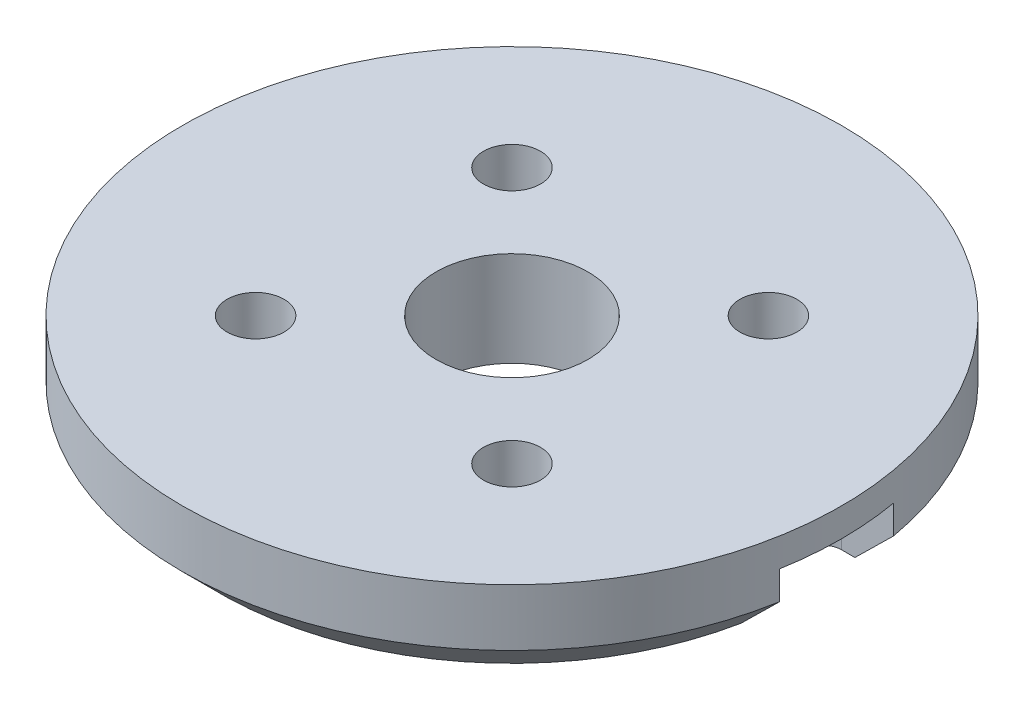
ISO-10303-21;
HEADER;
FILE_DESCRIPTION(('STEP AP214'),'2;1');
FILE_NAME('part.step','',(''),(''),'','','');
FILE_SCHEMA(('AUTOMOTIVE_DESIGN { 1 0 10303 214 1 1 1 1 }'));
ENDSEC;
DATA;
#1=APPLICATION_CONTEXT('core data for automotive mechanical design processes');
#2=APPLICATION_PROTOCOL_DEFINITION('international standard','automotive_design',2000,#1);
#3=PRODUCT_CONTEXT('',#1,'mechanical');
#4=PRODUCT('Part','Part','',(#3));
#5=PRODUCT_RELATED_PRODUCT_CATEGORY('part','',(#4));
#6=PRODUCT_DEFINITION_FORMATION('','',#4);
#7=PRODUCT_DEFINITION_CONTEXT('part definition',#1,'design');
#8=PRODUCT_DEFINITION('design','',#6,#7);
#9=PRODUCT_DEFINITION_SHAPE('','',#8);
#10=(LENGTH_UNIT() NAMED_UNIT(*) SI_UNIT(.MILLI.,.METRE.));
#11=(NAMED_UNIT(*) PLANE_ANGLE_UNIT() SI_UNIT($,.RADIAN.));
#12=(NAMED_UNIT(*) SI_UNIT($,.STERADIAN.) SOLID_ANGLE_UNIT());
#13=UNCERTAINTY_MEASURE_WITH_UNIT(LENGTH_MEASURE(1.E-05),#10,'distance_accuracy_value','');
#14=(GEOMETRIC_REPRESENTATION_CONTEXT(3) GLOBAL_UNCERTAINTY_ASSIGNED_CONTEXT((#13)) GLOBAL_UNIT_ASSIGNED_CONTEXT((#10,
#11,#12)) REPRESENTATION_CONTEXT('',''));
#15=CARTESIAN_POINT('',(0.,0.,0.));
#16=DIRECTION('',(0.,0.,1.));
#17=DIRECTION('',(1.,0.,0.));
#18=AXIS2_PLACEMENT_3D('',#15,#16,#17);
#19=CARTESIAN_POINT('',(0.,5.,0.));
#20=DIRECTION('',(0.,-1.,0.));
#21=DIRECTION('',(0.,0.,-1.));
#22=AXIS2_PLACEMENT_3D('',#19,#20,#21);
#23=CYLINDRICAL_SURFACE('',#22,17.35);
#24=CARTESIAN_POINT('',(0.,3.5,0.));
#25=DIRECTION('',(0.,-1.,0.));
#26=DIRECTION('',(0.,0.,-1.));
#27=AXIS2_PLACEMENT_3D('',#24,#25,#26);
#28=CIRCLE('',#27,17.35);
#29=CARTESIAN_POINT('',(17.0886658344061,3.5,-3.));
#30=VERTEX_POINT('',#29);
#31=CARTESIAN_POINT('',(17.0886658344061,3.5,3.));
#32=VERTEX_POINT('',#31);
#33=EDGE_CURVE('E11',#30,#32,#28,.T.);
#34=ORIENTED_EDGE('',*,*,#33,.F.);
#35=DIRECTION('',(0.,-1.,0.));
#36=VECTOR('',#35,1.);
#37=CARTESIAN_POINT('',(17.0886658344061,5.,-3.));
#38=LINE('',#37,#36);
#39=CARTESIAN_POINT('',(17.0886658344062,1.99999999999999,-3.));
#40=VERTEX_POINT('',#39);
#41=EDGE_CURVE('E144',#30,#40,#38,.T.);
#42=ORIENTED_EDGE('',*,*,#41,.T.);
#43=CARTESIAN_POINT('',(0.,1.99999999999999,0.));
#44=DIRECTION('',(0.,1.,0.));
#45=DIRECTION('',(0.,0.,1.));
#46=AXIS2_PLACEMENT_3D('',#43,#44,#45);
#47=CIRCLE('',#46,17.35);
#48=CARTESIAN_POINT('',(17.0886658344062,1.99999999999999,3.));
#49=VERTEX_POINT('',#48);
#50=EDGE_CURVE('E179',#40,#49,#47,.T.);
#51=ORIENTED_EDGE('',*,*,#50,.T.);
#52=DIRECTION('',(0.,-1.,0.));
#53=VECTOR('',#52,1.);
#54=CARTESIAN_POINT('',(17.0886658344061,5.,3.));
#55=LINE('',#54,#53);
#56=EDGE_CURVE('E55',#49,#32,#55,.F.);
#57=ORIENTED_EDGE('',*,*,#56,.T.);
#58=EDGE_LOOP('',(#34,#42,#51,#57));
#59=FACE_BOUND('',#58,.T.);
#60=CARTESIAN_POINT('',(0.,5.,0.));
#61=DIRECTION('',(0.,1.,0.));
#62=DIRECTION('',(0.,0.,1.));
#63=AXIS2_PLACEMENT_3D('',#60,#61,#62);
#64=CIRCLE('',#63,17.35);
#65=CARTESIAN_POINT('',(0.,5.,17.35));
#66=VERTEX_POINT('',#65);
#67=EDGE_CURVE('E174',#66,#66,#64,.T.);
#68=ORIENTED_EDGE('',*,*,#67,.F.);
#69=EDGE_LOOP('',(#68));
#70=FACE_BOUND('',#69,.T.);
#71=ADVANCED_FACE('F38',(#59,#70),#23,.T.);
#72=CARTESIAN_POINT('',(0.,5.,0.));
#73=DIRECTION('',(0.,1.,0.));
#74=DIRECTION('',(0.,0.,1.));
#75=AXIS2_PLACEMENT_3D('',#72,#73,#74);
#76=PLANE('',#75);
#77=CARTESIAN_POINT('',(6.75,5.,6.75000000000038));
#78=DIRECTION('',(0.,-1.,0.));
#79=DIRECTION('',(0.,0.,-1.));
#80=AXIS2_PLACEMENT_3D('',#77,#78,#79);
#81=CIRCLE('',#80,1.50000000000039);
#82=CARTESIAN_POINT('',(6.75,5.,5.24999999999999));
#83=VERTEX_POINT('',#82);
#84=EDGE_CURVE('E157',#83,#83,#81,.T.);
#85=ORIENTED_EDGE('',*,*,#84,.T.);
#86=EDGE_LOOP('',(#85));
#87=FACE_BOUND('',#86,.T.);
#88=CARTESIAN_POINT('',(-6.74999999999962,5.,-6.75));
#89=DIRECTION('',(0.,-1.,0.));
#90=DIRECTION('',(0.,0.,-1.));
#91=AXIS2_PLACEMENT_3D('',#88,#89,#90);
#92=CIRCLE('',#91,1.5000000000002);
#93=CARTESIAN_POINT('',(-6.74999999999962,5.,-8.2500000000002));
#94=VERTEX_POINT('',#93);
#95=EDGE_CURVE('E150',#94,#94,#92,.T.);
#96=ORIENTED_EDGE('',*,*,#95,.T.);
#97=EDGE_LOOP('',(#96));
#98=FACE_BOUND('',#97,.T.);
#99=CARTESIAN_POINT('',(6.75000000000038,5.,-6.74999999999962));
#100=DIRECTION('',(0.,-1.,0.));
#101=DIRECTION('',(0.,0.,-1.));
#102=AXIS2_PLACEMENT_3D('',#99,#100,#101);
#103=CIRCLE('',#102,1.50000000000053);
#104=CARTESIAN_POINT('',(6.75000000000038,5.,-8.25000000000015));
#105=VERTEX_POINT('',#104);
#106=EDGE_CURVE('E146',#105,#105,#103,.T.);
#107=ORIENTED_EDGE('',*,*,#106,.T.);
#108=EDGE_LOOP('',(#107));
#109=FACE_BOUND('',#108,.T.);
#110=CARTESIAN_POINT('',(-6.75,5.,6.75));
#111=DIRECTION('',(0.,-1.,0.));
#112=DIRECTION('',(0.,0.,-1.));
#113=AXIS2_PLACEMENT_3D('',#110,#111,#112);
#114=CIRCLE('',#113,1.5);
#115=CARTESIAN_POINT('',(-6.75,5.,5.25));
#116=VERTEX_POINT('',#115);
#117=EDGE_CURVE('E165',#116,#116,#114,.T.);
#118=ORIENTED_EDGE('',*,*,#117,.T.);
#119=EDGE_LOOP('',(#118));
#120=FACE_BOUND('',#119,.T.);
#121=CARTESIAN_POINT('',(0.,5.,0.));
#122=DIRECTION('',(0.,1.,0.));
#123=DIRECTION('',(0.,0.,1.));
#124=AXIS2_PLACEMENT_3D('',#121,#122,#123);
#125=CIRCLE('',#124,4.);
#126=CARTESIAN_POINT('',(0.,5.,4.));
#127=VERTEX_POINT('',#126);
#128=EDGE_CURVE('E168',#127,#127,#125,.T.);
#129=ORIENTED_EDGE('',*,*,#128,.F.);
#130=EDGE_LOOP('',(#129));
#131=FACE_BOUND('',#130,.T.);
#132=ORIENTED_EDGE('',*,*,#67,.T.);
#133=EDGE_LOOP('',(#132));
#134=FACE_BOUND('',#133,.T.);
#135=ADVANCED_FACE('F223',(#87,#98,#109,#120,#131,#134),#76,.T.);
#136=CARTESIAN_POINT('',(0.,0.,0.));
#137=DIRECTION('',(0.,1.,0.));
#138=DIRECTION('',(0.,0.,1.));
#139=AXIS2_PLACEMENT_3D('',#136,#137,#138);
#140=PLANE('',#139);
#141=CARTESIAN_POINT('',(6.75,0.,6.75000000000038));
#142=DIRECTION('',(0.,-1.,0.));
#143=DIRECTION('',(0.,0.,-1.));
#144=AXIS2_PLACEMENT_3D('',#141,#142,#143);
#145=CIRCLE('',#144,1.50000000000039);
#146=CARTESIAN_POINT('',(6.75,0.,5.24999999999999));
#147=VERTEX_POINT('',#146);
#148=EDGE_CURVE('E153',#147,#147,#145,.T.);
#149=ORIENTED_EDGE('',*,*,#148,.F.);
#150=EDGE_LOOP('',(#149));
#151=FACE_BOUND('',#150,.T.);
#152=CARTESIAN_POINT('',(-6.74999999999962,0.,-6.75));
#153=DIRECTION('',(0.,-1.,0.));
#154=DIRECTION('',(0.,0.,-1.));
#155=AXIS2_PLACEMENT_3D('',#152,#153,#154);
#156=CIRCLE('',#155,1.5000000000002);
#157=CARTESIAN_POINT('',(-6.74999999999962,0.,-8.2500000000002));
#158=VERTEX_POINT('',#157);
#159=EDGE_CURVE('E160',#158,#158,#156,.T.);
#160=ORIENTED_EDGE('',*,*,#159,.F.);
#161=EDGE_LOOP('',(#160));
#162=FACE_BOUND('',#161,.T.);
#163=CARTESIAN_POINT('',(6.75000000000038,0.,-6.74999999999962));
#164=DIRECTION('',(0.,-1.,0.));
#165=DIRECTION('',(0.,0.,-1.));
#166=AXIS2_PLACEMENT_3D('',#163,#164,#165);
#167=CIRCLE('',#166,1.50000000000053);
#168=CARTESIAN_POINT('',(6.75000000000038,0.,-8.25000000000015));
#169=VERTEX_POINT('',#168);
#170=EDGE_CURVE('E147',#169,#169,#167,.T.);
#171=ORIENTED_EDGE('',*,*,#170,.F.);
#172=EDGE_LOOP('',(#171));
#173=FACE_BOUND('',#172,.T.);
#174=CARTESIAN_POINT('',(-6.75,0.,6.75));
#175=DIRECTION('',(0.,-1.,0.));
#176=DIRECTION('',(0.,0.,-1.));
#177=AXIS2_PLACEMENT_3D('',#174,#175,#176);
#178=CIRCLE('',#177,1.5);
#179=CARTESIAN_POINT('',(-6.75,0.,5.25));
#180=VERTEX_POINT('',#179);
#181=EDGE_CURVE('E156',#180,#180,#178,.T.);
#182=ORIENTED_EDGE('',*,*,#181,.F.);
#183=EDGE_LOOP('',(#182));
#184=FACE_BOUND('',#183,.T.);
#185=CARTESIAN_POINT('',(0.,0.,0.));
#186=DIRECTION('',(0.,1.,0.));
#187=DIRECTION('',(0.,0.,1.));
#188=AXIS2_PLACEMENT_3D('',#185,#186,#187);
#189=CIRCLE('',#188,4.);
#190=CARTESIAN_POINT('',(0.,0.,4.));
#191=VERTEX_POINT('',#190);
#192=EDGE_CURVE('E171',#191,#191,#189,.T.);
#193=ORIENTED_EDGE('',*,*,#192,.T.);
#194=EDGE_LOOP('',(#193));
#195=FACE_BOUND('',#194,.T.);
#196=CARTESIAN_POINT('',(0.,0.,0.));
#197=DIRECTION('',(0.,1.,0.));
#198=DIRECTION('',(0.,0.,1.));
#199=AXIS2_PLACEMENT_3D('',#196,#197,#198);
#200=CIRCLE('',#199,15.35);
#201=CARTESIAN_POINT('',(15.0539861830679,0.,3.));
#202=VERTEX_POINT('',#201);
#203=CARTESIAN_POINT('',(15.0539861830679,0.,-3.));
#204=VERTEX_POINT('',#203);
#205=EDGE_CURVE('E182',#202,#204,#200,.F.);
#206=ORIENTED_EDGE('',*,*,#205,.T.);
#207=DIRECTION('',(1.,0.,0.));
#208=VECTOR('',#207,1.);
#209=CARTESIAN_POINT('',(14.35,0.,-3.));
#210=LINE('',#209,#208);
#211=CARTESIAN_POINT('',(14.35,0.,-3.));
#212=VERTEX_POINT('',#211);
#213=EDGE_CURVE('E105',#212,#204,#210,.T.);
#214=ORIENTED_EDGE('',*,*,#213,.F.);
#215=CARTESIAN_POINT('',(14.35,0.,-2.));
#216=DIRECTION('',(0.,-1.,0.));
#217=DIRECTION('',(0.,0.,-1.));
#218=AXIS2_PLACEMENT_3D('',#215,#216,#217);
#219=CIRCLE('',#218,1.);
#220=CARTESIAN_POINT('',(13.35,0.,-1.99999999999999));
#221=VERTEX_POINT('',#220);
#222=EDGE_CURVE('E134',#221,#212,#219,.T.);
#223=ORIENTED_EDGE('',*,*,#222,.F.);
#224=DIRECTION('',(0.,0.,-1.));
#225=VECTOR('',#224,1.);
#226=CARTESIAN_POINT('',(13.35,0.,1.99999999999999));
#227=LINE('',#226,#225);
#228=CARTESIAN_POINT('',(13.35,0.,1.99999999999999));
#229=VERTEX_POINT('',#228);
#230=EDGE_CURVE('E131',#229,#221,#227,.T.);
#231=ORIENTED_EDGE('',*,*,#230,.F.);
#232=CARTESIAN_POINT('',(14.35,0.,2.));
#233=DIRECTION('',(0.,-1.,0.));
#234=DIRECTION('',(0.,0.,-1.));
#235=AXIS2_PLACEMENT_3D('',#232,#233,#234);
#236=CIRCLE('',#235,1.);
#237=CARTESIAN_POINT('',(14.35,0.,3.));
#238=VERTEX_POINT('',#237);
#239=EDGE_CURVE('E129',#238,#229,#236,.T.);
#240=ORIENTED_EDGE('',*,*,#239,.F.);
#241=DIRECTION('',(-1.,0.,0.));
#242=VECTOR('',#241,1.);
#243=CARTESIAN_POINT('',(14.35,0.,3.));
#244=LINE('',#243,#242);
#245=EDGE_CURVE('E111',#202,#238,#244,.T.);
#246=ORIENTED_EDGE('',*,*,#245,.F.);
#247=EDGE_LOOP('',(#206,#214,#223,#231,#240,#246));
#248=FACE_BOUND('',#247,.T.);
#249=ADVANCED_FACE('F226',(#151,#162,#173,#184,#195,#248),#140,.F.);
#250=CARTESIAN_POINT('',(0.,1.99999999999999,0.));
#251=DIRECTION('',(0.,1.,0.));
#252=DIRECTION('',(0.,0.,1.));
#253=AXIS2_PLACEMENT_3D('',#250,#251,#252);
#254=CONICAL_SURFACE('',#253,17.35,0.785398163397452);
#255=CARTESIAN_POINT('',(11.3546192408097,-3.60575127546398,-3.));
#256=CARTESIAN_POINT('',(11.7485366715798,-3.22486695799007,-3.));
#257=CARTESIAN_POINT('',(12.1418435815279,-2.84335272127463,-3.));
#258=CARTESIAN_POINT('',(12.9274758383312,-2.07931661446152,-3.));
#259=CARTESIAN_POINT('',(13.3198011875421,-1.69679474678646,-3.));
#260=CARTESIAN_POINT('',(14.1037088254747,-0.930996550780616,-3.));
#261=CARTESIAN_POINT('',(14.4952911196089,-0.547720227987082,-3.));
#262=CARTESIAN_POINT('',(15.2778671345998,0.219433258865943,-3.));
#263=CARTESIAN_POINT('',(15.6688608550495,0.603310423340503,-3.));
#264=CARTESIAN_POINT('',(16.8411380556166,1.75564831448771,-3.));
#265=CARTESIAN_POINT('',(17.6217224403827,2.52482019839818,-3.));
#266=CARTESIAN_POINT('',(18.7916672889781,3.67952716645954,-3.));
#267=CARTESIAN_POINT('',(19.1814951006494,4.06458914850199,-3.));
#268=CARTESIAN_POINT('',(19.9608854980985,4.8349810377664,-3.));
#269=CARTESIAN_POINT('',(20.3504480840157,5.22031094484749,-3.));
#270=CARTESIAN_POINT('',(20.7399014346527,5.60575127546396,-3.));
#271=B_SPLINE_CURVE_WITH_KNOTS('',3,(#255,#256,#257,#258,#259,#260,#261,#262,#263,#264,#265,
#266,#267,#268,#269,#270),.UNSPECIFIED.,.F.,.F.,(4,2,2,2,2,2,2,4),(0.,1.64383303413465,
3.28766211966972,4.93147918513119,6.57529738666114,9.86291337095675,11.5067338898756,
13.1505535451949),.UNSPECIFIED.);
#272=EDGE_CURVE('E48',#204,#40,#271,.T.);
#273=ORIENTED_EDGE('',*,*,#272,.F.);
#274=ORIENTED_EDGE('',*,*,#205,.F.);
#275=CARTESIAN_POINT('',(20.7399014346528,5.60575127546397,3.));
#276=CARTESIAN_POINT('',(20.3504480840157,5.22031094484749,3.));
#277=CARTESIAN_POINT('',(19.9608854980986,4.8349810377664,3.));
#278=CARTESIAN_POINT('',(19.1814951006494,4.06458914850199,3.));
#279=CARTESIAN_POINT('',(18.7916672889781,3.67952716645954,3.));
#280=CARTESIAN_POINT('',(17.6217224403827,2.52482019839818,3.));
#281=CARTESIAN_POINT('',(16.8411380556166,1.75564831448772,3.));
#282=CARTESIAN_POINT('',(15.6688608550495,0.603310423340505,3.));
#283=CARTESIAN_POINT('',(15.2778671345998,0.219433258865945,3.));
#284=CARTESIAN_POINT('',(14.4952911196089,-0.547720227987082,3.));
#285=CARTESIAN_POINT('',(14.1037088254747,-0.930996550780615,3.));
#286=CARTESIAN_POINT('',(13.3198011875421,-1.69679474678646,3.));
#287=CARTESIAN_POINT('',(12.9274758383312,-2.07931661446151,3.));
#288=CARTESIAN_POINT('',(12.1418435815279,-2.84335272127463,3.));
#289=CARTESIAN_POINT('',(11.7485366715798,-3.22486695799008,3.));
#290=CARTESIAN_POINT('',(11.3546192408097,-3.60575127546398,3.));
#291=B_SPLINE_CURVE_WITH_KNOTS('',3,(#275,#276,#277,#278,#279,#280,#281,#282,#283,#284,#285,
#286,#287,#288,#289,#290),.UNSPECIFIED.,.F.,.F.,(4,2,2,2,2,2,2,4),(0.,1.64381965531931,
3.28764017423814,6.57525615853375,8.21907436006371,9.86289142552518,11.5067205110602,
13.1505535451949),.UNSPECIFIED.);
#292=EDGE_CURVE('E185',#49,#202,#291,.T.);
#293=ORIENTED_EDGE('',*,*,#292,.F.);
#294=ORIENTED_EDGE('',*,*,#50,.F.);
#295=EDGE_LOOP('',(#273,#274,#293,#294));
#296=FACE_BOUND('',#295,.T.);
#297=ADVANCED_FACE('F41',(#296),#254,.T.);
#298=CARTESIAN_POINT('',(0.,0.,0.));
#299=DIRECTION('',(0.,1.,0.));
#300=DIRECTION('',(0.,0.,1.));
#301=AXIS2_PLACEMENT_3D('',#298,#299,#300);
#302=CYLINDRICAL_SURFACE('',#301,4.);
#303=ORIENTED_EDGE('',*,*,#192,.F.);
#304=EDGE_LOOP('',(#303));
#305=FACE_BOUND('',#304,.T.);
#306=ORIENTED_EDGE('',*,*,#128,.T.);
#307=EDGE_LOOP('',(#306));
#308=FACE_BOUND('',#307,.T.);
#309=ADVANCED_FACE('F218',(#305,#308),#302,.F.);
#310=CARTESIAN_POINT('',(-6.75,5.,6.75));
#311=DIRECTION('',(0.,-1.,0.));
#312=DIRECTION('',(0.,0.,-1.));
#313=AXIS2_PLACEMENT_3D('',#310,#311,#312);
#314=CYLINDRICAL_SURFACE('',#313,1.5);
#315=ORIENTED_EDGE('',*,*,#117,.F.);
#316=EDGE_LOOP('',(#315));
#317=FACE_BOUND('',#316,.T.);
#318=ORIENTED_EDGE('',*,*,#181,.T.);
#319=EDGE_LOOP('',(#318));
#320=FACE_BOUND('',#319,.T.);
#321=ADVANCED_FACE('F207',(#317,#320),#314,.F.);
#322=CARTESIAN_POINT('',(6.75000000000038,5.,-6.74999999999962));
#323=DIRECTION('',(0.,-1.,0.));
#324=DIRECTION('',(0.,0.,-1.));
#325=AXIS2_PLACEMENT_3D('',#322,#323,#324);
#326=CYLINDRICAL_SURFACE('',#325,1.50000000000053);
#327=ORIENTED_EDGE('',*,*,#106,.F.);
#328=EDGE_LOOP('',(#327));
#329=FACE_BOUND('',#328,.T.);
#330=ORIENTED_EDGE('',*,*,#170,.T.);
#331=EDGE_LOOP('',(#330));
#332=FACE_BOUND('',#331,.T.);
#333=ADVANCED_FACE('F203',(#329,#332),#326,.F.);
#334=CARTESIAN_POINT('',(-6.74999999999962,5.,-6.75));
#335=DIRECTION('',(0.,-1.,0.));
#336=DIRECTION('',(0.,0.,-1.));
#337=AXIS2_PLACEMENT_3D('',#334,#335,#336);
#338=CYLINDRICAL_SURFACE('',#337,1.5000000000002);
#339=ORIENTED_EDGE('',*,*,#95,.F.);
#340=EDGE_LOOP('',(#339));
#341=FACE_BOUND('',#340,.T.);
#342=ORIENTED_EDGE('',*,*,#159,.T.);
#343=EDGE_LOOP('',(#342));
#344=FACE_BOUND('',#343,.T.);
#345=ADVANCED_FACE('F206',(#341,#344),#338,.F.);
#346=CARTESIAN_POINT('',(6.75,5.,6.75000000000038));
#347=DIRECTION('',(0.,-1.,0.));
#348=DIRECTION('',(0.,0.,-1.));
#349=AXIS2_PLACEMENT_3D('',#346,#347,#348);
#350=CYLINDRICAL_SURFACE('',#349,1.50000000000039);
#351=ORIENTED_EDGE('',*,*,#84,.F.);
#352=EDGE_LOOP('',(#351));
#353=FACE_BOUND('',#352,.T.);
#354=ORIENTED_EDGE('',*,*,#148,.T.);
#355=EDGE_LOOP('',(#354));
#356=FACE_BOUND('',#355,.T.);
#357=ADVANCED_FACE('F209',(#353,#356),#350,.F.);
#358=CARTESIAN_POINT('',(14.35,3.5,-2.));
#359=DIRECTION('',(0.,-1.,0.));
#360=DIRECTION('',(0.,0.,-1.));
#361=AXIS2_PLACEMENT_3D('',#358,#359,#360);
#362=PLANE('',#361);
#363=ORIENTED_EDGE('',*,*,#33,.T.);
#364=DIRECTION('',(-1.,0.,0.));
#365=VECTOR('',#364,1.);
#366=CARTESIAN_POINT('',(14.35,3.5,3.));
#367=LINE('',#366,#365);
#368=CARTESIAN_POINT('',(14.35,3.5,3.));
#369=VERTEX_POINT('',#368);
#370=EDGE_CURVE('E97',#32,#369,#367,.T.);
#371=ORIENTED_EDGE('',*,*,#370,.T.);
#372=CARTESIAN_POINT('',(14.35,3.5,2.));
#373=DIRECTION('',(0.,-1.,0.));
#374=DIRECTION('',(0.,0.,-1.));
#375=AXIS2_PLACEMENT_3D('',#372,#373,#374);
#376=CIRCLE('',#375,1.);
#377=CARTESIAN_POINT('',(13.35,3.5,1.99999999999999));
#378=VERTEX_POINT('',#377);
#379=EDGE_CURVE('E102',#369,#378,#376,.T.);
#380=ORIENTED_EDGE('',*,*,#379,.T.);
#381=DIRECTION('',(0.,0.,-1.));
#382=VECTOR('',#381,1.);
#383=CARTESIAN_POINT('',(13.35,3.5,1.99999999999999));
#384=LINE('',#383,#382);
#385=CARTESIAN_POINT('',(13.35,3.5,-1.99999999999999));
#386=VERTEX_POINT('',#385);
#387=EDGE_CURVE('E120',#378,#386,#384,.T.);
#388=ORIENTED_EDGE('',*,*,#387,.T.);
#389=CARTESIAN_POINT('',(14.35,3.5,-2.));
#390=DIRECTION('',(0.,-1.,0.));
#391=DIRECTION('',(0.,0.,-1.));
#392=AXIS2_PLACEMENT_3D('',#389,#390,#391);
#393=CIRCLE('',#392,1.);
#394=CARTESIAN_POINT('',(14.35,3.5,-3.));
#395=VERTEX_POINT('',#394);
#396=EDGE_CURVE('E122',#386,#395,#393,.T.);
#397=ORIENTED_EDGE('',*,*,#396,.T.);
#398=DIRECTION('',(1.,0.,0.));
#399=VECTOR('',#398,1.);
#400=CARTESIAN_POINT('',(14.35,3.5,-3.));
#401=LINE('',#400,#399);
#402=EDGE_CURVE('E116',#395,#30,#401,.T.);
#403=ORIENTED_EDGE('',*,*,#402,.T.);
#404=EDGE_LOOP('',(#363,#371,#380,#388,#397,#403));
#405=FACE_BOUND('',#404,.T.);
#406=ADVANCED_FACE('F99',(#405),#362,.T.);
#407=CARTESIAN_POINT('',(14.35,3.5,-3.));
#408=DIRECTION('',(0.,0.,-1.));
#409=DIRECTION('',(-1.,0.,0.));
#410=AXIS2_PLACEMENT_3D('',#407,#408,#409);
#411=PLANE('',#410);
#412=ORIENTED_EDGE('',*,*,#402,.F.);
#413=DIRECTION('',(0.,-1.,0.));
#414=VECTOR('',#413,1.);
#415=CARTESIAN_POINT('',(14.35,3.5,-3.));
#416=LINE('',#415,#414);
#417=EDGE_CURVE('E138',#395,#212,#416,.T.);
#418=ORIENTED_EDGE('',*,*,#417,.T.);
#419=ORIENTED_EDGE('',*,*,#213,.T.);
#420=ORIENTED_EDGE('',*,*,#272,.T.);
#421=ORIENTED_EDGE('',*,*,#41,.F.);
#422=EDGE_LOOP('',(#412,#418,#419,#420,#421));
#423=FACE_BOUND('',#422,.T.);
#424=ADVANCED_FACE('F201',(#423),#411,.F.);
#425=CARTESIAN_POINT('',(14.35,3.5,3.));
#426=DIRECTION('',(0.,0.,1.));
#427=DIRECTION('',(1.,0.,0.));
#428=AXIS2_PLACEMENT_3D('',#425,#426,#427);
#429=PLANE('',#428);
#430=ORIENTED_EDGE('',*,*,#292,.T.);
#431=ORIENTED_EDGE('',*,*,#245,.T.);
#432=DIRECTION('',(0.,-1.,0.));
#433=VECTOR('',#432,1.);
#434=CARTESIAN_POINT('',(14.35,3.5,3.));
#435=LINE('',#434,#433);
#436=EDGE_CURVE('E108',#369,#238,#435,.T.);
#437=ORIENTED_EDGE('',*,*,#436,.F.);
#438=ORIENTED_EDGE('',*,*,#370,.F.);
#439=ORIENTED_EDGE('',*,*,#56,.F.);
#440=EDGE_LOOP('',(#430,#431,#437,#438,#439));
#441=FACE_BOUND('',#440,.T.);
#442=ADVANCED_FACE('F109',(#441),#429,.F.);
#443=CARTESIAN_POINT('',(14.35,3.5,-2.));
#444=DIRECTION('',(0.,-1.,0.));
#445=DIRECTION('',(0.,0.,-1.));
#446=AXIS2_PLACEMENT_3D('',#443,#444,#445);
#447=CYLINDRICAL_SURFACE('',#446,1.);
#448=ORIENTED_EDGE('',*,*,#222,.T.);
#449=ORIENTED_EDGE('',*,*,#417,.F.);
#450=ORIENTED_EDGE('',*,*,#396,.F.);
#451=DIRECTION('',(0.,-1.,0.));
#452=VECTOR('',#451,1.);
#453=CARTESIAN_POINT('',(13.35,3.5,-1.99999999999999));
#454=LINE('',#453,#452);
#455=EDGE_CURVE('E140',#386,#221,#454,.T.);
#456=ORIENTED_EDGE('',*,*,#455,.T.);
#457=EDGE_LOOP('',(#448,#449,#450,#456));
#458=FACE_BOUND('',#457,.T.);
#459=ADVANCED_FACE('F200',(#458),#447,.F.);
#460=CARTESIAN_POINT('',(13.35,3.5,1.99999999999999));
#461=DIRECTION('',(-1.,0.,0.));
#462=DIRECTION('',(0.,0.,1.));
#463=AXIS2_PLACEMENT_3D('',#460,#461,#462);
#464=PLANE('',#463);
#465=ORIENTED_EDGE('',*,*,#230,.T.);
#466=ORIENTED_EDGE('',*,*,#455,.F.);
#467=ORIENTED_EDGE('',*,*,#387,.F.);
#468=DIRECTION('',(0.,-1.,0.));
#469=VECTOR('',#468,1.);
#470=CARTESIAN_POINT('',(13.35,3.5,1.99999999999999));
#471=LINE('',#470,#469);
#472=EDGE_CURVE('E115',#378,#229,#471,.T.);
#473=ORIENTED_EDGE('',*,*,#472,.T.);
#474=EDGE_LOOP('',(#465,#466,#467,#473));
#475=FACE_BOUND('',#474,.T.);
#476=ADVANCED_FACE('F245',(#475),#464,.F.);
#477=CARTESIAN_POINT('',(14.35,3.5,2.));
#478=DIRECTION('',(0.,-1.,0.));
#479=DIRECTION('',(0.,0.,-1.));
#480=AXIS2_PLACEMENT_3D('',#477,#478,#479);
#481=CYLINDRICAL_SURFACE('',#480,1.);
#482=ORIENTED_EDGE('',*,*,#239,.T.);
#483=ORIENTED_EDGE('',*,*,#472,.F.);
#484=ORIENTED_EDGE('',*,*,#379,.F.);
#485=ORIENTED_EDGE('',*,*,#436,.T.);
#486=EDGE_LOOP('',(#482,#483,#484,#485));
#487=FACE_BOUND('',#486,.T.);
#488=ADVANCED_FACE('F118',(#487),#481,.F.);
#489=CLOSED_SHELL('',(#71,#135,#249,#297,#309,#321,#333,#345,#357,#406,#424,#442,#459,#476,#488));
#490=MANIFOLD_SOLID_BREP('B2',#489);
#491=ADVANCED_BREP_SHAPE_REPRESENTATION('',(#18,#490),#14);
#492=SHAPE_DEFINITION_REPRESENTATION(#9,#491);
ENDSEC;
END-ISO-10303-21;
